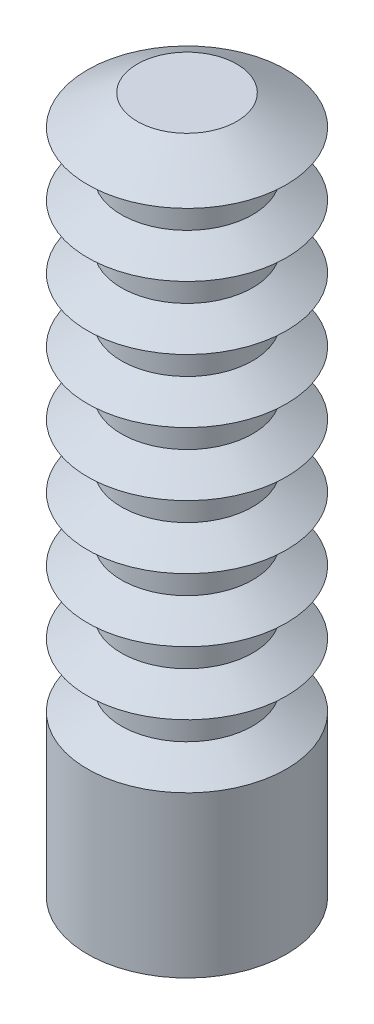
ISO-10303-21;
HEADER;
FILE_DESCRIPTION(('STEP AP214'),'2;1');
FILE_NAME('part.step','',(''),(''),'','','');
FILE_SCHEMA(('AUTOMOTIVE_DESIGN { 1 0 10303 214 1 1 1 1 }'));
ENDSEC;
DATA;
#1=APPLICATION_CONTEXT('core data for automotive mechanical design processes');
#2=APPLICATION_PROTOCOL_DEFINITION('international standard','automotive_design',2000,#1);
#3=PRODUCT_CONTEXT('',#1,'mechanical');
#4=PRODUCT('Part','Part','',(#3));
#5=PRODUCT_RELATED_PRODUCT_CATEGORY('part','',(#4));
#6=PRODUCT_DEFINITION_FORMATION('','',#4);
#7=PRODUCT_DEFINITION_CONTEXT('part definition',#1,'design');
#8=PRODUCT_DEFINITION('design','',#6,#7);
#9=PRODUCT_DEFINITION_SHAPE('','',#8);
#10=(LENGTH_UNIT() NAMED_UNIT(*) SI_UNIT(.MILLI.,.METRE.));
#11=(NAMED_UNIT(*) PLANE_ANGLE_UNIT() SI_UNIT($,.RADIAN.));
#12=(NAMED_UNIT(*) SI_UNIT($,.STERADIAN.) SOLID_ANGLE_UNIT());
#13=UNCERTAINTY_MEASURE_WITH_UNIT(LENGTH_MEASURE(1.E-05),#10,'distance_accuracy_value','');
#14=(GEOMETRIC_REPRESENTATION_CONTEXT(3) GLOBAL_UNCERTAINTY_ASSIGNED_CONTEXT((#13)) GLOBAL_UNIT_ASSIGNED_CONTEXT((#10,
#11,#12)) REPRESENTATION_CONTEXT('',''));
#15=CARTESIAN_POINT('',(0.,0.,0.));
#16=DIRECTION('',(0.,0.,1.));
#17=DIRECTION('',(1.,0.,0.));
#18=AXIS2_PLACEMENT_3D('',#15,#16,#17);
#19=CARTESIAN_POINT('',(0.,-0.800000000000002,0.));
#20=DIRECTION('',(0.,-1.,0.));
#21=DIRECTION('',(1.,0.,0.));
#22=AXIS2_PLACEMENT_3D('',#19,#20,#21);
#23=PLANE('',#22);
#24=CARTESIAN_POINT('',(-5.43163068128454,-0.800000000000002,0.));
#25=DIRECTION('',(0.,1.,0.));
#26=DIRECTION('',(-1.,0.,0.));
#27=AXIS2_PLACEMENT_3D('',#24,#25,#26);
#28=CIRCLE('',#27,5.);
#29=CARTESIAN_POINT('',(-10.4316306812845,-0.800000000000003,0.));
#30=VERTEX_POINT('',#29);
#31=EDGE_CURVE('E48',#30,#30,#28,.T.);
#32=ORIENTED_EDGE('',*,*,#31,.F.);
#33=EDGE_LOOP('',(#32));
#34=FACE_BOUND('',#33,.T.);
#35=ADVANCED_FACE('F32',(#34),#23,.T.);
#36=CARTESIAN_POINT('',(-5.43163068128454,34.1999999999994,0.));
#37=DIRECTION('',(0.,1.,0.));
#38=DIRECTION('',(-1.,0.,0.));
#39=AXIS2_PLACEMENT_3D('',#36,#37,#38);
#40=CYLINDRICAL_SURFACE('',#39,5.00000000000013);
#41=ORIENTED_EDGE('',*,*,#31,.T.);
#42=EDGE_LOOP('',(#41));
#43=FACE_BOUND('',#42,.T.);
#44=CARTESIAN_POINT('',(-5.43163068128454,7.2600000000012,0.));
#45=DIRECTION('',(0.,1.,0.));
#46=DIRECTION('',(-1.,0.,0.));
#47=AXIS2_PLACEMENT_3D('',#44,#45,#46);
#48=CIRCLE('',#47,5.00000000000026);
#49=CARTESIAN_POINT('',(-10.4316306812848,7.2600000000012,0.));
#50=VERTEX_POINT('',#49);
#51=EDGE_CURVE('E53',#50,#50,#48,.T.);
#52=ORIENTED_EDGE('',*,*,#51,.F.);
#53=EDGE_LOOP('',(#52));
#54=FACE_BOUND('',#53,.T.);
#55=ADVANCED_FACE('F241',(#43,#54),#40,.T.);
#56=CARTESIAN_POINT('',(-5.43163068128454,8.28000000000157,0.));
#57=DIRECTION('',(0.,-1.,0.));
#58=DIRECTION('',(1.,0.,0.));
#59=AXIS2_PLACEMENT_3D('',#56,#57,#58);
#60=CONICAL_SURFACE('',#59,3.29999999999555,1.03037682652537);
#61=ORIENTED_EDGE('',*,*,#51,.T.);
#62=EDGE_LOOP('',(#61));
#63=FACE_BOUND('',#62,.T.);
#64=CARTESIAN_POINT('',(-5.43163068128454,8.28000000000157,0.));
#65=DIRECTION('',(0.,1.,0.));
#66=DIRECTION('',(-1.,0.,0.));
#67=AXIS2_PLACEMENT_3D('',#64,#65,#66);
#68=CIRCLE('',#67,3.29999999999555);
#69=CARTESIAN_POINT('',(-8.73163068128009,8.28000000000157,0.));
#70=VERTEX_POINT('',#69);
#71=EDGE_CURVE('E56',#70,#70,#68,.T.);
#72=ORIENTED_EDGE('',*,*,#71,.F.);
#73=EDGE_LOOP('',(#72));
#74=FACE_BOUND('',#73,.T.);
#75=ADVANCED_FACE('F245',(#63,#74),#60,.T.);
#76=CARTESIAN_POINT('',(-5.43163068128454,34.1999999999994,0.));
#77=DIRECTION('',(0.,1.,0.));
#78=DIRECTION('',(-1.,0.,0.));
#79=AXIS2_PLACEMENT_3D('',#76,#77,#78);
#80=CYLINDRICAL_SURFACE('',#79,3.29999999999565);
#81=ORIENTED_EDGE('',*,*,#71,.T.);
#82=EDGE_LOOP('',(#81));
#83=FACE_BOUND('',#82,.T.);
#84=CARTESIAN_POINT('',(-5.43163068128454,9.42000000000347,0.));
#85=DIRECTION('',(0.,1.,0.));
#86=DIRECTION('',(-1.,0.,0.));
#87=AXIS2_PLACEMENT_3D('',#84,#85,#86);
#88=CIRCLE('',#87,3.29999999999575);
#89=CARTESIAN_POINT('',(-8.73163068128029,9.42000000000347,0.));
#90=VERTEX_POINT('',#89);
#91=EDGE_CURVE('E59',#90,#90,#88,.T.);
#92=ORIENTED_EDGE('',*,*,#91,.F.);
#93=EDGE_LOOP('',(#92));
#94=FACE_BOUND('',#93,.T.);
#95=ADVANCED_FACE('F249',(#83,#94),#80,.T.);
#96=CARTESIAN_POINT('',(-5.43163068128454,10.440000000001,0.));
#97=DIRECTION('',(0.,1.,0.));
#98=DIRECTION('',(-1.,0.,0.));
#99=AXIS2_PLACEMENT_3D('',#96,#97,#98);
#100=CONICAL_SURFACE('',#99,5.00000000000023,1.03037682652655);
#101=ORIENTED_EDGE('',*,*,#91,.T.);
#102=EDGE_LOOP('',(#101));
#103=FACE_BOUND('',#102,.T.);
#104=CARTESIAN_POINT('',(-5.43163068128454,10.440000000001,0.));
#105=DIRECTION('',(0.,1.,0.));
#106=DIRECTION('',(-1.,0.,0.));
#107=AXIS2_PLACEMENT_3D('',#104,#105,#106);
#108=CIRCLE('',#107,5.00000000000023);
#109=CARTESIAN_POINT('',(-10.4316306812848,10.440000000001,0.));
#110=VERTEX_POINT('',#109);
#111=EDGE_CURVE('E62',#110,#110,#108,.T.);
#112=ORIENTED_EDGE('',*,*,#111,.F.);
#113=EDGE_LOOP('',(#112));
#114=FACE_BOUND('',#113,.T.);
#115=ADVANCED_FACE('F253',(#103,#114),#100,.T.);
#116=CARTESIAN_POINT('',(-5.43163068128454,11.4600000000014,0.));
#117=DIRECTION('',(0.,-1.,0.));
#118=DIRECTION('',(1.,0.,0.));
#119=AXIS2_PLACEMENT_3D('',#116,#117,#118);
#120=CONICAL_SURFACE('',#119,3.29999999999552,1.03037682652538);
#121=ORIENTED_EDGE('',*,*,#111,.T.);
#122=EDGE_LOOP('',(#121));
#123=FACE_BOUND('',#122,.T.);
#124=CARTESIAN_POINT('',(-5.43163068128454,11.4600000000014,0.));
#125=DIRECTION('',(0.,1.,0.));
#126=DIRECTION('',(-1.,0.,0.));
#127=AXIS2_PLACEMENT_3D('',#124,#125,#126);
#128=CIRCLE('',#127,3.29999999999552);
#129=CARTESIAN_POINT('',(-8.73163068128006,11.4600000000014,0.));
#130=VERTEX_POINT('',#129);
#131=EDGE_CURVE('E65',#130,#130,#128,.T.);
#132=ORIENTED_EDGE('',*,*,#131,.F.);
#133=EDGE_LOOP('',(#132));
#134=FACE_BOUND('',#133,.T.);
#135=ADVANCED_FACE('F257',(#123,#134),#120,.T.);
#136=CARTESIAN_POINT('',(-5.43163068128454,34.1999999999994,0.));
#137=DIRECTION('',(0.,1.,0.));
#138=DIRECTION('',(-1.,0.,0.));
#139=AXIS2_PLACEMENT_3D('',#136,#137,#138);
#140=CYLINDRICAL_SURFACE('',#139,3.29999999999562);
#141=ORIENTED_EDGE('',*,*,#131,.T.);
#142=EDGE_LOOP('',(#141));
#143=FACE_BOUND('',#142,.T.);
#144=CARTESIAN_POINT('',(-5.43163068128454,12.6000000000033,0.));
#145=DIRECTION('',(0.,1.,0.));
#146=DIRECTION('',(-1.,0.,0.));
#147=AXIS2_PLACEMENT_3D('',#144,#145,#146);
#148=CIRCLE('',#147,3.29999999999572);
#149=CARTESIAN_POINT('',(-8.73163068128025,12.6000000000033,0.));
#150=VERTEX_POINT('',#149);
#151=EDGE_CURVE('E68',#150,#150,#148,.T.);
#152=ORIENTED_EDGE('',*,*,#151,.F.);
#153=EDGE_LOOP('',(#152));
#154=FACE_BOUND('',#153,.T.);
#155=ADVANCED_FACE('F261',(#143,#154),#140,.T.);
#156=CARTESIAN_POINT('',(-5.43163068128454,13.6200000000008,0.));
#157=DIRECTION('',(0.,1.,0.));
#158=DIRECTION('',(-1.,0.,0.));
#159=AXIS2_PLACEMENT_3D('',#156,#157,#158);
#160=CONICAL_SURFACE('',#159,5.0000000000002,1.03037682652655);
#161=ORIENTED_EDGE('',*,*,#151,.T.);
#162=EDGE_LOOP('',(#161));
#163=FACE_BOUND('',#162,.T.);
#164=CARTESIAN_POINT('',(-5.43163068128454,13.6200000000008,0.));
#165=DIRECTION('',(0.,1.,0.));
#166=DIRECTION('',(-1.,0.,0.));
#167=AXIS2_PLACEMENT_3D('',#164,#165,#166);
#168=CIRCLE('',#167,5.0000000000002);
#169=CARTESIAN_POINT('',(-10.4316306812847,13.6200000000008,0.));
#170=VERTEX_POINT('',#169);
#171=EDGE_CURVE('E71',#170,#170,#168,.T.);
#172=ORIENTED_EDGE('',*,*,#171,.F.);
#173=EDGE_LOOP('',(#172));
#174=FACE_BOUND('',#173,.T.);
#175=ADVANCED_FACE('F265',(#163,#174),#160,.T.);
#176=CARTESIAN_POINT('',(-5.43163068128454,14.6400000000011,0.));
#177=DIRECTION('',(0.,-1.,0.));
#178=DIRECTION('',(1.,0.,0.));
#179=AXIS2_PLACEMENT_3D('',#176,#177,#178);
#180=CONICAL_SURFACE('',#179,3.29999999999549,1.03037682652538);
#181=ORIENTED_EDGE('',*,*,#171,.T.);
#182=EDGE_LOOP('',(#181));
#183=FACE_BOUND('',#182,.T.);
#184=CARTESIAN_POINT('',(-5.43163068128454,14.6400000000011,0.));
#185=DIRECTION('',(0.,1.,0.));
#186=DIRECTION('',(-1.,0.,0.));
#187=AXIS2_PLACEMENT_3D('',#184,#185,#186);
#188=CIRCLE('',#187,3.29999999999549);
#189=CARTESIAN_POINT('',(-8.73163068128002,14.6400000000011,0.));
#190=VERTEX_POINT('',#189);
#191=EDGE_CURVE('E74',#190,#190,#188,.T.);
#192=ORIENTED_EDGE('',*,*,#191,.F.);
#193=EDGE_LOOP('',(#192));
#194=FACE_BOUND('',#193,.T.);
#195=ADVANCED_FACE('F269',(#183,#194),#180,.T.);
#196=CARTESIAN_POINT('',(-5.43163068128454,34.1999999999994,0.));
#197=DIRECTION('',(0.,1.,0.));
#198=DIRECTION('',(-1.,0.,0.));
#199=AXIS2_PLACEMENT_3D('',#196,#197,#198);
#200=CYLINDRICAL_SURFACE('',#199,3.29999999999558);
#201=ORIENTED_EDGE('',*,*,#191,.T.);
#202=EDGE_LOOP('',(#201));
#203=FACE_BOUND('',#202,.T.);
#204=CARTESIAN_POINT('',(-5.43163068128454,15.780000000003,0.));
#205=DIRECTION('',(0.,1.,0.));
#206=DIRECTION('',(-1.,0.,0.));
#207=AXIS2_PLACEMENT_3D('',#204,#205,#206);
#208=CIRCLE('',#207,3.29999999999568);
#209=CARTESIAN_POINT('',(-8.73163068128022,15.780000000003,0.));
#210=VERTEX_POINT('',#209);
#211=EDGE_CURVE('E77',#210,#210,#208,.T.);
#212=ORIENTED_EDGE('',*,*,#211,.F.);
#213=EDGE_LOOP('',(#212));
#214=FACE_BOUND('',#213,.T.);
#215=ADVANCED_FACE('F273',(#203,#214),#200,.T.);
#216=CARTESIAN_POINT('',(-5.43163068128454,16.8000000000005,0.));
#217=DIRECTION('',(0.,1.,0.));
#218=DIRECTION('',(-1.,0.,0.));
#219=AXIS2_PLACEMENT_3D('',#216,#217,#218);
#220=CONICAL_SURFACE('',#219,5.00000000000017,1.03037682652655);
#221=ORIENTED_EDGE('',*,*,#211,.T.);
#222=EDGE_LOOP('',(#221));
#223=FACE_BOUND('',#222,.T.);
#224=CARTESIAN_POINT('',(-5.43163068128454,16.8000000000005,0.));
#225=DIRECTION('',(0.,1.,0.));
#226=DIRECTION('',(-1.,0.,0.));
#227=AXIS2_PLACEMENT_3D('',#224,#225,#226);
#228=CIRCLE('',#227,5.00000000000017);
#229=CARTESIAN_POINT('',(-10.4316306812847,16.8000000000005,0.));
#230=VERTEX_POINT('',#229);
#231=EDGE_CURVE('E80',#230,#230,#228,.T.);
#232=ORIENTED_EDGE('',*,*,#231,.F.);
#233=EDGE_LOOP('',(#232));
#234=FACE_BOUND('',#233,.T.);
#235=ADVANCED_FACE('F277',(#223,#234),#220,.T.);
#236=CARTESIAN_POINT('',(-5.43163068128454,17.8200000000009,0.));
#237=DIRECTION('',(0.,-1.,0.));
#238=DIRECTION('',(1.,0.,0.));
#239=AXIS2_PLACEMENT_3D('',#236,#237,#238);
#240=CONICAL_SURFACE('',#239,3.29999999999545,1.03037682652538);
#241=ORIENTED_EDGE('',*,*,#231,.T.);
#242=EDGE_LOOP('',(#241));
#243=FACE_BOUND('',#242,.T.);
#244=CARTESIAN_POINT('',(-5.43163068128454,17.8200000000009,0.));
#245=DIRECTION('',(0.,1.,0.));
#246=DIRECTION('',(-1.,0.,0.));
#247=AXIS2_PLACEMENT_3D('',#244,#245,#246);
#248=CIRCLE('',#247,3.29999999999545);
#249=CARTESIAN_POINT('',(-8.73163068127999,17.8200000000009,0.));
#250=VERTEX_POINT('',#249);
#251=EDGE_CURVE('E83',#250,#250,#248,.T.);
#252=ORIENTED_EDGE('',*,*,#251,.F.);
#253=EDGE_LOOP('',(#252));
#254=FACE_BOUND('',#253,.T.);
#255=ADVANCED_FACE('F281',(#243,#254),#240,.T.);
#256=CARTESIAN_POINT('',(-5.43163068128454,34.1999999999994,0.));
#257=DIRECTION('',(0.,1.,0.));
#258=DIRECTION('',(-1.,0.,0.));
#259=AXIS2_PLACEMENT_3D('',#256,#257,#258);
#260=CYLINDRICAL_SURFACE('',#259,3.29999999999555);
#261=ORIENTED_EDGE('',*,*,#251,.T.);
#262=EDGE_LOOP('',(#261));
#263=FACE_BOUND('',#262,.T.);
#264=CARTESIAN_POINT('',(-5.43163068128454,18.9600000000028,0.));
#265=DIRECTION('',(0.,1.,0.));
#266=DIRECTION('',(-1.,0.,0.));
#267=AXIS2_PLACEMENT_3D('',#264,#265,#266);
#268=CIRCLE('',#267,3.29999999999565);
#269=CARTESIAN_POINT('',(-8.73163068128019,18.9600000000028,0.));
#270=VERTEX_POINT('',#269);
#271=EDGE_CURVE('E86',#270,#270,#268,.T.);
#272=ORIENTED_EDGE('',*,*,#271,.F.);
#273=EDGE_LOOP('',(#272));
#274=FACE_BOUND('',#273,.T.);
#275=ADVANCED_FACE('F285',(#263,#274),#260,.T.);
#276=CARTESIAN_POINT('',(-5.43163068128454,19.9800000000003,0.));
#277=DIRECTION('',(0.,1.,0.));
#278=DIRECTION('',(-1.,0.,0.));
#279=AXIS2_PLACEMENT_3D('',#276,#277,#278);
#280=CONICAL_SURFACE('',#279,5.00000000000013,1.03037682652656);
#281=ORIENTED_EDGE('',*,*,#271,.T.);
#282=EDGE_LOOP('',(#281));
#283=FACE_BOUND('',#282,.T.);
#284=CARTESIAN_POINT('',(-5.43163068128454,19.9800000000003,0.));
#285=DIRECTION('',(0.,1.,0.));
#286=DIRECTION('',(-1.,0.,0.));
#287=AXIS2_PLACEMENT_3D('',#284,#285,#286);
#288=CIRCLE('',#287,5.00000000000013);
#289=CARTESIAN_POINT('',(-10.4316306812847,19.9800000000003,0.));
#290=VERTEX_POINT('',#289);
#291=EDGE_CURVE('E89',#290,#290,#288,.T.);
#292=ORIENTED_EDGE('',*,*,#291,.F.);
#293=EDGE_LOOP('',(#292));
#294=FACE_BOUND('',#293,.T.);
#295=ADVANCED_FACE('F289',(#283,#294),#280,.T.);
#296=CARTESIAN_POINT('',(-5.43163068128454,21.0000000000007,0.));
#297=DIRECTION('',(0.,-1.,0.));
#298=DIRECTION('',(1.,0.,0.));
#299=AXIS2_PLACEMENT_3D('',#296,#297,#298);
#300=CONICAL_SURFACE('',#299,3.29999999999542,1.03037682652538);
#301=ORIENTED_EDGE('',*,*,#291,.T.);
#302=EDGE_LOOP('',(#301));
#303=FACE_BOUND('',#302,.T.);
#304=CARTESIAN_POINT('',(-5.43163068128454,21.0000000000007,0.));
#305=DIRECTION('',(0.,1.,0.));
#306=DIRECTION('',(-1.,0.,0.));
#307=AXIS2_PLACEMENT_3D('',#304,#305,#306);
#308=CIRCLE('',#307,3.29999999999542);
#309=CARTESIAN_POINT('',(-8.73163068127996,21.0000000000007,0.));
#310=VERTEX_POINT('',#309);
#311=EDGE_CURVE('E92',#310,#310,#308,.T.);
#312=ORIENTED_EDGE('',*,*,#311,.F.);
#313=EDGE_LOOP('',(#312));
#314=FACE_BOUND('',#313,.T.);
#315=ADVANCED_FACE('F293',(#303,#314),#300,.T.);
#316=CARTESIAN_POINT('',(-5.43163068128454,34.1999999999994,0.));
#317=DIRECTION('',(0.,1.,0.));
#318=DIRECTION('',(-1.,0.,0.));
#319=AXIS2_PLACEMENT_3D('',#316,#317,#318);
#320=CYLINDRICAL_SURFACE('',#319,3.29999999999552);
#321=ORIENTED_EDGE('',*,*,#311,.T.);
#322=EDGE_LOOP('',(#321));
#323=FACE_BOUND('',#322,.T.);
#324=CARTESIAN_POINT('',(-5.43163068128454,22.1400000000026,0.));
#325=DIRECTION('',(0.,1.,0.));
#326=DIRECTION('',(-1.,0.,0.));
#327=AXIS2_PLACEMENT_3D('',#324,#325,#326);
#328=CIRCLE('',#327,3.29999999999562);
#329=CARTESIAN_POINT('',(-8.73163068128015,22.1400000000026,0.));
#330=VERTEX_POINT('',#329);
#331=EDGE_CURVE('E95',#330,#330,#328,.T.);
#332=ORIENTED_EDGE('',*,*,#331,.F.);
#333=EDGE_LOOP('',(#332));
#334=FACE_BOUND('',#333,.T.);
#335=ADVANCED_FACE('F297',(#323,#334),#320,.T.);
#336=CARTESIAN_POINT('',(-5.43163068128454,23.1600000000001,0.));
#337=DIRECTION('',(0.,1.,0.));
#338=DIRECTION('',(-1.,0.,0.));
#339=AXIS2_PLACEMENT_3D('',#336,#337,#338);
#340=CONICAL_SURFACE('',#339,5.0000000000001,1.03037682652655);
#341=ORIENTED_EDGE('',*,*,#331,.T.);
#342=EDGE_LOOP('',(#341));
#343=FACE_BOUND('',#342,.T.);
#344=CARTESIAN_POINT('',(-5.43163068128454,23.1600000000001,0.));
#345=DIRECTION('',(0.,1.,0.));
#346=DIRECTION('',(-1.,0.,0.));
#347=AXIS2_PLACEMENT_3D('',#344,#345,#346);
#348=CIRCLE('',#347,5.0000000000001);
#349=CARTESIAN_POINT('',(-10.4316306812846,23.1600000000001,0.));
#350=VERTEX_POINT('',#349);
#351=EDGE_CURVE('E98',#350,#350,#348,.T.);
#352=ORIENTED_EDGE('',*,*,#351,.F.);
#353=EDGE_LOOP('',(#352));
#354=FACE_BOUND('',#353,.T.);
#355=ADVANCED_FACE('F301',(#343,#354),#340,.T.);
#356=CARTESIAN_POINT('',(-5.43163068128454,24.1800000000005,0.));
#357=DIRECTION('',(0.,-1.,0.));
#358=DIRECTION('',(1.,0.,0.));
#359=AXIS2_PLACEMENT_3D('',#356,#357,#358);
#360=CONICAL_SURFACE('',#359,3.29999999999539,1.03037682652538);
#361=ORIENTED_EDGE('',*,*,#351,.T.);
#362=EDGE_LOOP('',(#361));
#363=FACE_BOUND('',#362,.T.);
#364=CARTESIAN_POINT('',(-5.43163068128454,24.1800000000005,0.));
#365=DIRECTION('',(0.,1.,0.));
#366=DIRECTION('',(-1.,0.,0.));
#367=AXIS2_PLACEMENT_3D('',#364,#365,#366);
#368=CIRCLE('',#367,3.29999999999539);
#369=CARTESIAN_POINT('',(-8.73163068127993,24.1800000000005,0.));
#370=VERTEX_POINT('',#369);
#371=EDGE_CURVE('E101',#370,#370,#368,.T.);
#372=ORIENTED_EDGE('',*,*,#371,.F.);
#373=EDGE_LOOP('',(#372));
#374=FACE_BOUND('',#373,.T.);
#375=ADVANCED_FACE('F305',(#363,#374),#360,.T.);
#376=CARTESIAN_POINT('',(-5.43163068128454,34.1999999999994,0.));
#377=DIRECTION('',(0.,1.,0.));
#378=DIRECTION('',(-1.,0.,0.));
#379=AXIS2_PLACEMENT_3D('',#376,#377,#378);
#380=CYLINDRICAL_SURFACE('',#379,3.29999999999549);
#381=ORIENTED_EDGE('',*,*,#371,.T.);
#382=EDGE_LOOP('',(#381));
#383=FACE_BOUND('',#382,.T.);
#384=CARTESIAN_POINT('',(-5.43163068128454,25.3200000000024,0.));
#385=DIRECTION('',(0.,1.,0.));
#386=DIRECTION('',(-1.,0.,0.));
#387=AXIS2_PLACEMENT_3D('',#384,#385,#386);
#388=CIRCLE('',#387,3.29999999999558);
#389=CARTESIAN_POINT('',(-8.73163068128012,25.3200000000024,0.));
#390=VERTEX_POINT('',#389);
#391=EDGE_CURVE('E104',#390,#390,#388,.T.);
#392=ORIENTED_EDGE('',*,*,#391,.F.);
#393=EDGE_LOOP('',(#392));
#394=FACE_BOUND('',#393,.T.);
#395=ADVANCED_FACE('F309',(#383,#394),#380,.T.);
#396=CARTESIAN_POINT('',(-5.43163068128454,26.3399999999999,0.));
#397=DIRECTION('',(0.,1.,0.));
#398=DIRECTION('',(-1.,0.,0.));
#399=AXIS2_PLACEMENT_3D('',#396,#397,#398);
#400=CONICAL_SURFACE('',#399,5.00000000000007,1.03037682652655);
#401=ORIENTED_EDGE('',*,*,#391,.T.);
#402=EDGE_LOOP('',(#401));
#403=FACE_BOUND('',#402,.T.);
#404=CARTESIAN_POINT('',(-5.43163068128454,26.3399999999999,0.));
#405=DIRECTION('',(0.,1.,0.));
#406=DIRECTION('',(-1.,0.,0.));
#407=AXIS2_PLACEMENT_3D('',#404,#405,#406);
#408=CIRCLE('',#407,5.00000000000007);
#409=CARTESIAN_POINT('',(-10.4316306812846,26.3399999999999,0.));
#410=VERTEX_POINT('',#409);
#411=EDGE_CURVE('E107',#410,#410,#408,.T.);
#412=ORIENTED_EDGE('',*,*,#411,.F.);
#413=EDGE_LOOP('',(#412));
#414=FACE_BOUND('',#413,.T.);
#415=ADVANCED_FACE('F313',(#403,#414),#400,.T.);
#416=CARTESIAN_POINT('',(-5.43163068128454,27.3600000000005,0.));
#417=DIRECTION('',(0.,-1.,0.));
#418=DIRECTION('',(1.,0.,0.));
#419=AXIS2_PLACEMENT_3D('',#416,#417,#418);
#420=CONICAL_SURFACE('',#419,3.29999999999549,1.03037682652524);
#421=ORIENTED_EDGE('',*,*,#411,.T.);
#422=EDGE_LOOP('',(#421));
#423=FACE_BOUND('',#422,.T.);
#424=CARTESIAN_POINT('',(-5.43163068128454,27.3600000000005,0.));
#425=DIRECTION('',(0.,1.,0.));
#426=DIRECTION('',(-1.,0.,0.));
#427=AXIS2_PLACEMENT_3D('',#424,#425,#426);
#428=CIRCLE('',#427,3.29999999999549);
#429=CARTESIAN_POINT('',(-8.73163068128003,27.3600000000005,0.));
#430=VERTEX_POINT('',#429);
#431=EDGE_CURVE('E110',#430,#430,#428,.T.);
#432=ORIENTED_EDGE('',*,*,#431,.F.);
#433=EDGE_LOOP('',(#432));
#434=FACE_BOUND('',#433,.T.);
#435=ADVANCED_FACE('F317',(#423,#434),#420,.T.);
#436=CARTESIAN_POINT('',(-5.43163068128454,34.1999999999994,0.));
#437=DIRECTION('',(0.,1.,0.));
#438=DIRECTION('',(-1.,0.,0.));
#439=AXIS2_PLACEMENT_3D('',#436,#437,#438);
#440=CYLINDRICAL_SURFACE('',#439,3.29999999999552);
#441=ORIENTED_EDGE('',*,*,#431,.T.);
#442=EDGE_LOOP('',(#441));
#443=FACE_BOUND('',#442,.T.);
#444=CARTESIAN_POINT('',(-5.43163068128454,28.5000000000021,0.));
#445=DIRECTION('',(0.,1.,0.));
#446=DIRECTION('',(-1.,0.,0.));
#447=AXIS2_PLACEMENT_3D('',#444,#445,#446);
#448=CIRCLE('',#447,3.29999999999555);
#449=CARTESIAN_POINT('',(-8.73163068128009,28.5000000000021,0.));
#450=VERTEX_POINT('',#449);
#451=EDGE_CURVE('E113',#450,#450,#448,.T.);
#452=ORIENTED_EDGE('',*,*,#451,.F.);
#453=EDGE_LOOP('',(#452));
#454=FACE_BOUND('',#453,.T.);
#455=ADVANCED_FACE('F321',(#443,#454),#440,.T.);
#456=CARTESIAN_POINT('',(-5.43163068128454,29.5199999999997,0.));
#457=DIRECTION('',(0.,1.,0.));
#458=DIRECTION('',(-1.,0.,0.));
#459=AXIS2_PLACEMENT_3D('',#456,#457,#458);
#460=CONICAL_SURFACE('',#459,5.00000000000004,1.03037682652655);
#461=ORIENTED_EDGE('',*,*,#451,.T.);
#462=EDGE_LOOP('',(#461));
#463=FACE_BOUND('',#462,.T.);
#464=CARTESIAN_POINT('',(-5.43163068128454,29.5199999999997,0.));
#465=DIRECTION('',(0.,1.,0.));
#466=DIRECTION('',(-1.,0.,0.));
#467=AXIS2_PLACEMENT_3D('',#464,#465,#466);
#468=CIRCLE('',#467,5.00000000000004);
#469=CARTESIAN_POINT('',(-10.4316306812846,29.5199999999997,0.));
#470=VERTEX_POINT('',#469);
#471=EDGE_CURVE('E116',#470,#470,#468,.T.);
#472=ORIENTED_EDGE('',*,*,#471,.F.);
#473=EDGE_LOOP('',(#472));
#474=FACE_BOUND('',#473,.T.);
#475=ADVANCED_FACE('F325',(#463,#474),#460,.T.);
#476=CARTESIAN_POINT('',(-5.43163068128454,30.54,0.));
#477=DIRECTION('',(0.,-1.,0.));
#478=DIRECTION('',(1.,0.,0.));
#479=AXIS2_PLACEMENT_3D('',#476,#477,#478);
#480=CONICAL_SURFACE('',#479,3.29999999999532,1.03037682652538);
#481=ORIENTED_EDGE('',*,*,#471,.T.);
#482=EDGE_LOOP('',(#481));
#483=FACE_BOUND('',#482,.T.);
#484=CARTESIAN_POINT('',(-5.43163068128454,30.54,0.));
#485=DIRECTION('',(0.,1.,0.));
#486=DIRECTION('',(-1.,0.,0.));
#487=AXIS2_PLACEMENT_3D('',#484,#485,#486);
#488=CIRCLE('',#487,3.29999999999532);
#489=CARTESIAN_POINT('',(-8.73163068127986,30.54,0.));
#490=VERTEX_POINT('',#489);
#491=EDGE_CURVE('E119',#490,#490,#488,.T.);
#492=ORIENTED_EDGE('',*,*,#491,.F.);
#493=EDGE_LOOP('',(#492));
#494=FACE_BOUND('',#493,.T.);
#495=ADVANCED_FACE('F329',(#483,#494),#480,.T.);
#496=CARTESIAN_POINT('',(-5.43163068128454,34.1999999999994,0.));
#497=DIRECTION('',(0.,1.,0.));
#498=DIRECTION('',(-1.,0.,0.));
#499=AXIS2_PLACEMENT_3D('',#496,#497,#498);
#500=CYLINDRICAL_SURFACE('',#499,3.29999999999542);
#501=ORIENTED_EDGE('',*,*,#491,.T.);
#502=EDGE_LOOP('',(#501));
#503=FACE_BOUND('',#502,.T.);
#504=CARTESIAN_POINT('',(-5.43163068128454,31.6800000000019,0.));
#505=DIRECTION('',(0.,1.,0.));
#506=DIRECTION('',(-1.,0.,0.));
#507=AXIS2_PLACEMENT_3D('',#504,#505,#506);
#508=CIRCLE('',#507,3.29999999999552);
#509=CARTESIAN_POINT('',(-8.73163068128006,31.6800000000019,0.));
#510=VERTEX_POINT('',#509);
#511=EDGE_CURVE('E122',#510,#510,#508,.T.);
#512=ORIENTED_EDGE('',*,*,#511,.F.);
#513=EDGE_LOOP('',(#512));
#514=FACE_BOUND('',#513,.T.);
#515=ADVANCED_FACE('F333',(#503,#514),#500,.T.);
#516=CARTESIAN_POINT('',(-5.43163068128454,32.6999999999994,0.));
#517=DIRECTION('',(0.,1.,0.));
#518=DIRECTION('',(-1.,0.,0.));
#519=AXIS2_PLACEMENT_3D('',#516,#517,#518);
#520=CONICAL_SURFACE('',#519,5.,1.03037682652655);
#521=ORIENTED_EDGE('',*,*,#511,.T.);
#522=EDGE_LOOP('',(#521));
#523=FACE_BOUND('',#522,.T.);
#524=CARTESIAN_POINT('',(-5.43163068128454,32.6999999999994,0.));
#525=DIRECTION('',(0.,1.,0.));
#526=DIRECTION('',(-1.,0.,0.));
#527=AXIS2_PLACEMENT_3D('',#524,#525,#526);
#528=CIRCLE('',#527,5.);
#529=CARTESIAN_POINT('',(-10.4316306812845,32.6999999999994,0.));
#530=VERTEX_POINT('',#529);
#531=EDGE_CURVE('E125',#530,#530,#528,.T.);
#532=ORIENTED_EDGE('',*,*,#531,.F.);
#533=EDGE_LOOP('',(#532));
#534=FACE_BOUND('',#533,.T.);
#535=ADVANCED_FACE('F337',(#523,#534),#520,.T.);
#536=CARTESIAN_POINT('',(-5.43163068128454,34.1999999999994,0.));
#537=DIRECTION('',(0.,-1.,0.));
#538=DIRECTION('',(1.,0.,0.));
#539=AXIS2_PLACEMENT_3D('',#536,#537,#538);
#540=CONICAL_SURFACE('',#539,2.5,1.03037682652431);
#541=ORIENTED_EDGE('',*,*,#531,.T.);
#542=EDGE_LOOP('',(#541));
#543=FACE_BOUND('',#542,.T.);
#544=CARTESIAN_POINT('',(-5.43163068128454,34.1999999999994,0.));
#545=DIRECTION('',(0.,1.,0.));
#546=DIRECTION('',(-1.,0.,0.));
#547=AXIS2_PLACEMENT_3D('',#544,#545,#546);
#548=CIRCLE('',#547,2.5);
#549=CARTESIAN_POINT('',(-7.93163068128454,34.1999999999994,0.));
#550=VERTEX_POINT('',#549);
#551=EDGE_CURVE('E128',#550,#550,#548,.T.);
#552=ORIENTED_EDGE('',*,*,#551,.F.);
#553=EDGE_LOOP('',(#552));
#554=FACE_BOUND('',#553,.T.);
#555=ADVANCED_FACE('F341',(#543,#554),#540,.T.);
#556=CARTESIAN_POINT('',(0.,34.1999999999994,0.));
#557=DIRECTION('',(0.,-1.,0.));
#558=DIRECTION('',(1.,0.,0.));
#559=AXIS2_PLACEMENT_3D('',#556,#557,#558);
#560=PLANE('',#559);
#561=ORIENTED_EDGE('',*,*,#551,.T.);
#562=EDGE_LOOP('',(#561));
#563=FACE_BOUND('',#562,.T.);
#564=ADVANCED_FACE('F345',(#563),#560,.F.);
#565=CLOSED_SHELL('',(#35,#55,#75,#95,#115,#135,#155,#175,#195,#215,#235,#255,#275,#295,#315,
#335,#355,#375,#395,#415,#435,#455,#475,#495,#515,#535,#555,#564));
#566=CARTESIAN_POINT('',(-5.43163068128454,7.9600000000012,0.));
#567=DIRECTION('',(0.,-1.,0.));
#568=DIRECTION('',(1.,0.,0.));
#569=AXIS2_PLACEMENT_3D('',#566,#567,#568);
#570=CONICAL_SURFACE('',#569,2.29276466619247,1.02132101334301);
#571=CARTESIAN_POINT('',(-5.43163068128454,7.25999999999998,0.));
#572=DIRECTION('',(0.,1.,0.));
#573=DIRECTION('',(-1.,0.,0.));
#574=AXIS2_PLACEMENT_3D('',#571,#572,#573);
#575=CIRCLE('',#574,3.43583917011756);
#576=CARTESIAN_POINT('',(-8.8674698514021,7.25999999999998,0.));
#577=VERTEX_POINT('',#576);
#578=EDGE_CURVE('E10',#577,#577,#575,.T.);
#579=ORIENTED_EDGE('',*,*,#578,.F.);
#580=EDGE_LOOP('',(#579));
#581=FACE_BOUND('',#580,.T.);
#582=CARTESIAN_POINT('',(-5.43163068128454,7.9600000000012,0.));
#583=DIRECTION('',(0.,1.,0.));
#584=DIRECTION('',(-1.,0.,0.));
#585=AXIS2_PLACEMENT_3D('',#582,#583,#584);
#586=CIRCLE('',#585,2.29276466619247);
#587=CARTESIAN_POINT('',(-7.72439534747701,7.9600000000012,0.));
#588=VERTEX_POINT('',#587);
#589=EDGE_CURVE('E203',#588,#588,#586,.T.);
#590=ORIENTED_EDGE('',*,*,#589,.T.);
#591=EDGE_LOOP('',(#590));
#592=FACE_BOUND('',#591,.T.);
#593=ADVANCED_FACE('F34',(#581,#592),#570,.F.);
#594=CARTESIAN_POINT('',(-5.43163068128454,7.25999999999998,0.));
#595=DIRECTION('',(0.,-1.,0.));
#596=DIRECTION('',(1.,0.,0.));
#597=AXIS2_PLACEMENT_3D('',#594,#595,#596);
#598=CONICAL_SURFACE('',#597,3.43583917011756,1.02509404757199);
#599=CARTESIAN_POINT('',(-5.43163068128454,6.79599581917429,0.));
#600=DIRECTION('',(0.,1.,0.));
#601=DIRECTION('',(-1.,0.,0.));
#602=AXIS2_PLACEMENT_3D('',#599,#600,#601);
#603=CIRCLE('',#602,4.2);
#604=CARTESIAN_POINT('',(-9.63163068128454,6.79599581917429,0.));
#605=VERTEX_POINT('',#604);
#606=EDGE_CURVE('E40',#605,#605,#603,.T.);
#607=ORIENTED_EDGE('',*,*,#606,.F.);
#608=EDGE_LOOP('',(#607));
#609=FACE_BOUND('',#608,.T.);
#610=ORIENTED_EDGE('',*,*,#578,.T.);
#611=EDGE_LOOP('',(#610));
#612=FACE_BOUND('',#611,.T.);
#613=ADVANCED_FACE('F221',(#609,#612),#598,.F.);
#614=CARTESIAN_POINT('',(-5.43163068128454,34.1999999999994,0.));
#615=DIRECTION('',(0.,1.,0.));
#616=DIRECTION('',(-1.,0.,0.));
#617=AXIS2_PLACEMENT_3D('',#614,#615,#616);
#618=CYLINDRICAL_SURFACE('',#617,4.2);
#619=ORIENTED_EDGE('',*,*,#606,.T.);
#620=EDGE_LOOP('',(#619));
#621=FACE_BOUND('',#620,.T.);
#622=CARTESIAN_POINT('',(-5.43163068128454,0.,0.));
#623=DIRECTION('',(0.,1.,0.));
#624=DIRECTION('',(-1.,0.,0.));
#625=AXIS2_PLACEMENT_3D('',#622,#623,#624);
#626=CIRCLE('',#625,4.2);
#627=CARTESIAN_POINT('',(-9.63163068128454,0.,0.));
#628=VERTEX_POINT('',#627);
#629=EDGE_CURVE('E44',#628,#628,#626,.T.);
#630=ORIENTED_EDGE('',*,*,#629,.F.);
#631=EDGE_LOOP('',(#630));
#632=FACE_BOUND('',#631,.T.);
#633=ADVANCED_FACE('F227',(#621,#632),#618,.F.);
#634=CARTESIAN_POINT('',(0.,0.,0.));
#635=DIRECTION('',(0.,1.,0.));
#636=DIRECTION('',(-1.,0.,0.));
#637=AXIS2_PLACEMENT_3D('',#634,#635,#636);
#638=PLANE('',#637);
#639=ORIENTED_EDGE('',*,*,#629,.T.);
#640=EDGE_LOOP('',(#639));
#641=FACE_BOUND('',#640,.T.);
#642=ADVANCED_FACE('F232',(#641),#638,.T.);
#643=CARTESIAN_POINT('',(0.,33.3999999999994,0.));
#644=DIRECTION('',(0.,1.,0.));
#645=DIRECTION('',(-1.,0.,0.));
#646=AXIS2_PLACEMENT_3D('',#643,#644,#645);
#647=PLANE('',#646);
#648=CARTESIAN_POINT('',(-5.43163068128454,33.3999999999994,0.));
#649=DIRECTION('',(0.,1.,0.));
#650=DIRECTION('',(-1.,0.,0.));
#651=AXIS2_PLACEMENT_3D('',#648,#649,#650);
#652=CIRCLE('',#651,2.29276466619221);
#653=CARTESIAN_POINT('',(-7.72439534747675,33.3999999999994,0.));
#654=VERTEX_POINT('',#653);
#655=EDGE_CURVE('E131',#654,#654,#652,.T.);
#656=ORIENTED_EDGE('',*,*,#655,.F.);
#657=EDGE_LOOP('',(#656));
#658=FACE_BOUND('',#657,.T.);
#659=ADVANCED_FACE('F237',(#658),#647,.F.);
#660=CARTESIAN_POINT('',(-5.43163068128454,32.6999999999982,0.));
#661=DIRECTION('',(0.,-1.,0.));
#662=DIRECTION('',(1.,0.,0.));
#663=AXIS2_PLACEMENT_3D('',#660,#661,#662);
#664=CONICAL_SURFACE('',#663,3.4358391701173,1.02132101334301);
#665=ORIENTED_EDGE('',*,*,#655,.T.);
#666=EDGE_LOOP('',(#665));
#667=FACE_BOUND('',#666,.T.);
#668=CARTESIAN_POINT('',(-5.43163068128454,32.6999999999982,0.));
#669=DIRECTION('',(0.,1.,0.));
#670=DIRECTION('',(-1.,0.,0.));
#671=AXIS2_PLACEMENT_3D('',#668,#669,#670);
#672=CIRCLE('',#671,3.4358391701173);
#673=CARTESIAN_POINT('',(-8.86746985140184,32.6999999999982,0.));
#674=VERTEX_POINT('',#673);
#675=EDGE_CURVE('E134',#674,#674,#672,.T.);
#676=ORIENTED_EDGE('',*,*,#675,.F.);
#677=EDGE_LOOP('',(#676));
#678=FACE_BOUND('',#677,.T.);
#679=ADVANCED_FACE('F351',(#667,#678),#664,.F.);
#680=CARTESIAN_POINT('',(-5.43163068128454,32.014155297645,0.));
#681=DIRECTION('',(0.,1.,0.));
#682=DIRECTION('',(-1.,0.,0.));
#683=AXIS2_PLACEMENT_3D('',#680,#681,#682);
#684=CONICAL_SURFACE('',#683,2.29276466619226,1.03037682652546);
#685=ORIENTED_EDGE('',*,*,#675,.T.);
#686=EDGE_LOOP('',(#685));
#687=FACE_BOUND('',#686,.T.);
#688=CARTESIAN_POINT('',(-5.43163068128454,32.014155297645,0.));
#689=DIRECTION('',(0.,1.,0.));
#690=DIRECTION('',(-1.,0.,0.));
#691=AXIS2_PLACEMENT_3D('',#688,#689,#690);
#692=CIRCLE('',#691,2.29276466619226);
#693=CARTESIAN_POINT('',(-7.7243953474768,32.014155297645,0.));
#694=VERTEX_POINT('',#693);
#695=EDGE_CURVE('E137',#694,#694,#692,.T.);
#696=ORIENTED_EDGE('',*,*,#695,.F.);
#697=EDGE_LOOP('',(#696));
#698=FACE_BOUND('',#697,.T.);
#699=ADVANCED_FACE('F355',(#687,#698),#684,.F.);
#700=CARTESIAN_POINT('',(-5.43163068128454,34.1999999999994,0.));
#701=DIRECTION('',(0.,1.,0.));
#702=DIRECTION('',(-1.,0.,0.));
#703=AXIS2_PLACEMENT_3D('',#700,#701,#702);
#704=CYLINDRICAL_SURFACE('',#703,2.29276466619225);
#705=ORIENTED_EDGE('',*,*,#695,.T.);
#706=EDGE_LOOP('',(#705));
#707=FACE_BOUND('',#706,.T.);
#708=CARTESIAN_POINT('',(-5.43163068128454,30.2199999999997,0.));
#709=DIRECTION('',(0.,1.,0.));
#710=DIRECTION('',(-1.,0.,0.));
#711=AXIS2_PLACEMENT_3D('',#708,#709,#710);
#712=CIRCLE('',#711,2.29276466619224);
#713=CARTESIAN_POINT('',(-7.72439534747678,30.2199999999997,0.));
#714=VERTEX_POINT('',#713);
#715=EDGE_CURVE('E140',#714,#714,#712,.T.);
#716=ORIENTED_EDGE('',*,*,#715,.F.);
#717=EDGE_LOOP('',(#716));
#718=FACE_BOUND('',#717,.T.);
#719=ADVANCED_FACE('F359',(#707,#718),#704,.F.);
#720=CARTESIAN_POINT('',(-5.43163068128454,30.2199999999997,0.));
#721=DIRECTION('',(0.,-1.,0.));
#722=DIRECTION('',(1.,0.,0.));
#723=AXIS2_PLACEMENT_3D('',#720,#721,#722);
#724=CONICAL_SURFACE('',#723,2.29276466619224,1.02132101334301);
#725=CARTESIAN_POINT('',(-5.43163068128454,29.5199999999984,0.));
#726=DIRECTION('',(0.,1.,0.));
#727=DIRECTION('',(-1.,0.,0.));
#728=AXIS2_PLACEMENT_3D('',#725,#726,#727);
#729=CIRCLE('',#728,3.43583917011733);
#730=CARTESIAN_POINT('',(-8.86746985140187,29.5199999999984,0.));
#731=VERTEX_POINT('',#730);
#732=EDGE_CURVE('E143',#731,#731,#729,.T.);
#733=ORIENTED_EDGE('',*,*,#732,.F.);
#734=EDGE_LOOP('',(#733));
#735=FACE_BOUND('',#734,.T.);
#736=ORIENTED_EDGE('',*,*,#715,.T.);
#737=EDGE_LOOP('',(#736));
#738=FACE_BOUND('',#737,.T.);
#739=ADVANCED_FACE('F363',(#735,#738),#724,.F.);
#740=CARTESIAN_POINT('',(-5.43163068128454,28.8341552976452,0.));
#741=DIRECTION('',(0.,1.,0.));
#742=DIRECTION('',(-1.,0.,0.));
#743=AXIS2_PLACEMENT_3D('',#740,#741,#742);
#744=CONICAL_SURFACE('',#743,2.2927646661923,1.03037682652546);
#745=ORIENTED_EDGE('',*,*,#732,.T.);
#746=EDGE_LOOP('',(#745));
#747=FACE_BOUND('',#746,.T.);
#748=CARTESIAN_POINT('',(-5.43163068128454,28.8341552976452,0.));
#749=DIRECTION('',(0.,1.,0.));
#750=DIRECTION('',(-1.,0.,0.));
#751=AXIS2_PLACEMENT_3D('',#748,#749,#750);
#752=CIRCLE('',#751,2.2927646661923);
#753=CARTESIAN_POINT('',(-7.72439534747684,28.8341552976452,0.));
#754=VERTEX_POINT('',#753);
#755=EDGE_CURVE('E146',#754,#754,#752,.T.);
#756=ORIENTED_EDGE('',*,*,#755,.F.);
#757=EDGE_LOOP('',(#756));
#758=FACE_BOUND('',#757,.T.);
#759=ADVANCED_FACE('F367',(#747,#758),#744,.F.);
#760=CARTESIAN_POINT('',(-5.43163068128454,34.1999999999994,0.));
#761=DIRECTION('',(0.,1.,0.));
#762=DIRECTION('',(-1.,0.,0.));
#763=AXIS2_PLACEMENT_3D('',#760,#761,#762);
#764=CYLINDRICAL_SURFACE('',#763,2.29276466619238);
#765=ORIENTED_EDGE('',*,*,#755,.T.);
#766=EDGE_LOOP('',(#765));
#767=FACE_BOUND('',#766,.T.);
#768=CARTESIAN_POINT('',(-5.43163068128454,27.04,0.));
#769=DIRECTION('',(0.,1.,0.));
#770=DIRECTION('',(-1.,0.,0.));
#771=AXIS2_PLACEMENT_3D('',#768,#769,#770);
#772=CIRCLE('',#771,2.29276466619246);
#773=CARTESIAN_POINT('',(-7.724395347477,27.04,0.));
#774=VERTEX_POINT('',#773);
#775=EDGE_CURVE('E149',#774,#774,#772,.T.);
#776=ORIENTED_EDGE('',*,*,#775,.F.);
#777=EDGE_LOOP('',(#776));
#778=FACE_BOUND('',#777,.T.);
#779=ADVANCED_FACE('F371',(#767,#778),#764,.F.);
#780=CARTESIAN_POINT('',(-5.43163068128454,27.04,0.));
#781=DIRECTION('',(0.,-1.,0.));
#782=DIRECTION('',(1.,0.,0.));
#783=AXIS2_PLACEMENT_3D('',#780,#781,#782);
#784=CONICAL_SURFACE('',#783,2.29276466619246,1.02132101334285);
#785=CARTESIAN_POINT('',(-5.43163068128454,26.3399999999987,0.));
#786=DIRECTION('',(0.,1.,0.));
#787=DIRECTION('',(-1.,0.,0.));
#788=AXIS2_PLACEMENT_3D('',#785,#786,#787);
#789=CIRCLE('',#788,3.43583917011736);
#790=CARTESIAN_POINT('',(-8.8674698514019,26.3399999999987,0.));
#791=VERTEX_POINT('',#790);
#792=EDGE_CURVE('E152',#791,#791,#789,.T.);
#793=ORIENTED_EDGE('',*,*,#792,.F.);
#794=EDGE_LOOP('',(#793));
#795=FACE_BOUND('',#794,.T.);
#796=ORIENTED_EDGE('',*,*,#775,.T.);
#797=EDGE_LOOP('',(#796));
#798=FACE_BOUND('',#797,.T.);
#799=ADVANCED_FACE('F375',(#795,#798),#784,.F.);
#800=CARTESIAN_POINT('',(-5.43163068128454,25.6541552976454,0.));
#801=DIRECTION('',(0.,1.,0.));
#802=DIRECTION('',(-1.,0.,0.));
#803=AXIS2_PLACEMENT_3D('',#800,#801,#802);
#804=CONICAL_SURFACE('',#803,2.29276466619233,1.03037682652546);
#805=ORIENTED_EDGE('',*,*,#792,.T.);
#806=EDGE_LOOP('',(#805));
#807=FACE_BOUND('',#806,.T.);
#808=CARTESIAN_POINT('',(-5.43163068128454,25.6541552976454,0.));
#809=DIRECTION('',(0.,1.,0.));
#810=DIRECTION('',(-1.,0.,0.));
#811=AXIS2_PLACEMENT_3D('',#808,#809,#810);
#812=CIRCLE('',#811,2.29276466619233);
#813=CARTESIAN_POINT('',(-7.72439534747687,25.6541552976454,0.));
#814=VERTEX_POINT('',#813);
#815=EDGE_CURVE('E155',#814,#814,#812,.T.);
#816=ORIENTED_EDGE('',*,*,#815,.F.);
#817=EDGE_LOOP('',(#816));
#818=FACE_BOUND('',#817,.T.);
#819=ADVANCED_FACE('F379',(#807,#818),#804,.F.);
#820=CARTESIAN_POINT('',(-5.43163068128454,34.1999999999994,0.));
#821=DIRECTION('',(0.,1.,0.));
#822=DIRECTION('',(-1.,0.,0.));
#823=AXIS2_PLACEMENT_3D('',#820,#821,#822);
#824=CYLINDRICAL_SURFACE('',#823,2.29276466619241);
#825=ORIENTED_EDGE('',*,*,#815,.T.);
#826=EDGE_LOOP('',(#825));
#827=FACE_BOUND('',#826,.T.);
#828=CARTESIAN_POINT('',(-5.43163068128454,23.86,0.));
#829=DIRECTION('',(0.,1.,0.));
#830=DIRECTION('',(-1.,0.,0.));
#831=AXIS2_PLACEMENT_3D('',#828,#829,#830);
#832=CIRCLE('',#831,2.2927646661925);
#833=CARTESIAN_POINT('',(-7.72439534747703,23.86,0.));
#834=VERTEX_POINT('',#833);
#835=EDGE_CURVE('E158',#834,#834,#832,.T.);
#836=ORIENTED_EDGE('',*,*,#835,.F.);
#837=EDGE_LOOP('',(#836));
#838=FACE_BOUND('',#837,.T.);
#839=ADVANCED_FACE('F383',(#827,#838),#824,.F.);
#840=CARTESIAN_POINT('',(-5.43163068128454,23.86,0.));
#841=DIRECTION('',(0.,-1.,0.));
#842=DIRECTION('',(1.,0.,0.));
#843=AXIS2_PLACEMENT_3D('',#840,#841,#842);
#844=CONICAL_SURFACE('',#843,2.2927646661925,1.02132101334299);
#845=CARTESIAN_POINT('',(-5.43163068128454,23.1599999999989,0.));
#846=DIRECTION('',(0.,1.,0.));
#847=DIRECTION('',(-1.,0.,0.));
#848=AXIS2_PLACEMENT_3D('',#845,#846,#847);
#849=CIRCLE('',#848,3.4358391701174);
#850=CARTESIAN_POINT('',(-8.86746985140193,23.1599999999989,0.));
#851=VERTEX_POINT('',#850);
#852=EDGE_CURVE('E161',#851,#851,#849,.T.);
#853=ORIENTED_EDGE('',*,*,#852,.F.);
#854=EDGE_LOOP('',(#853));
#855=FACE_BOUND('',#854,.T.);
#856=ORIENTED_EDGE('',*,*,#835,.T.);
#857=EDGE_LOOP('',(#856));
#858=FACE_BOUND('',#857,.T.);
#859=ADVANCED_FACE('F387',(#855,#858),#844,.F.);
#860=CARTESIAN_POINT('',(-5.43163068128454,22.4741552976456,0.));
#861=DIRECTION('',(0.,1.,0.));
#862=DIRECTION('',(-1.,0.,0.));
#863=AXIS2_PLACEMENT_3D('',#860,#861,#862);
#864=CONICAL_SURFACE('',#863,2.29276466619236,1.03037682652546);
#865=ORIENTED_EDGE('',*,*,#852,.T.);
#866=EDGE_LOOP('',(#865));
#867=FACE_BOUND('',#866,.T.);
#868=CARTESIAN_POINT('',(-5.43163068128454,22.4741552976456,0.));
#869=DIRECTION('',(0.,1.,0.));
#870=DIRECTION('',(-1.,0.,0.));
#871=AXIS2_PLACEMENT_3D('',#868,#869,#870);
#872=CIRCLE('',#871,2.29276466619236);
#873=CARTESIAN_POINT('',(-7.7243953474769,22.4741552976456,0.));
#874=VERTEX_POINT('',#873);
#875=EDGE_CURVE('E164',#874,#874,#872,.T.);
#876=ORIENTED_EDGE('',*,*,#875,.F.);
#877=EDGE_LOOP('',(#876));
#878=FACE_BOUND('',#877,.T.);
#879=ADVANCED_FACE('F391',(#867,#878),#864,.F.);
#880=CARTESIAN_POINT('',(-5.43163068128454,34.1999999999994,0.));
#881=DIRECTION('',(0.,1.,0.));
#882=DIRECTION('',(-1.,0.,0.));
#883=AXIS2_PLACEMENT_3D('',#880,#881,#882);
#884=CYLINDRICAL_SURFACE('',#883,2.29276466619241);
#885=ORIENTED_EDGE('',*,*,#875,.T.);
#886=EDGE_LOOP('',(#885));
#887=FACE_BOUND('',#886,.T.);
#888=CARTESIAN_POINT('',(-5.43163068128454,20.6800000000005,0.));
#889=DIRECTION('',(0.,1.,0.));
#890=DIRECTION('',(-1.,0.,0.));
#891=AXIS2_PLACEMENT_3D('',#888,#889,#890);
#892=CIRCLE('',#891,2.29276466619247);
#893=CARTESIAN_POINT('',(-7.72439534747701,20.6800000000005,0.));
#894=VERTEX_POINT('',#893);
#895=EDGE_CURVE('E167',#894,#894,#892,.T.);
#896=ORIENTED_EDGE('',*,*,#895,.F.);
#897=EDGE_LOOP('',(#896));
#898=FACE_BOUND('',#897,.T.);
#899=ADVANCED_FACE('F395',(#887,#898),#884,.F.);
#900=CARTESIAN_POINT('',(-5.43163068128454,20.6800000000005,0.));
#901=DIRECTION('',(0.,-1.,0.));
#902=DIRECTION('',(1.,0.,0.));
#903=AXIS2_PLACEMENT_3D('',#900,#901,#902);
#904=CONICAL_SURFACE('',#903,2.29276466619247,1.02132101334286);
#905=CARTESIAN_POINT('',(-5.43163068128454,19.9799999999991,0.));
#906=DIRECTION('',(0.,1.,0.));
#907=DIRECTION('',(-1.,0.,0.));
#908=AXIS2_PLACEMENT_3D('',#905,#906,#907);
#909=CIRCLE('',#908,3.43583917011743);
#910=CARTESIAN_POINT('',(-8.86746985140197,19.9799999999991,0.));
#911=VERTEX_POINT('',#910);
#912=EDGE_CURVE('E170',#911,#911,#909,.T.);
#913=ORIENTED_EDGE('',*,*,#912,.F.);
#914=EDGE_LOOP('',(#913));
#915=FACE_BOUND('',#914,.T.);
#916=ORIENTED_EDGE('',*,*,#895,.T.);
#917=EDGE_LOOP('',(#916));
#918=FACE_BOUND('',#917,.T.);
#919=ADVANCED_FACE('F399',(#915,#918),#904,.F.);
#920=CARTESIAN_POINT('',(-5.43163068128454,19.2941552976459,0.));
#921=DIRECTION('',(0.,1.,0.));
#922=DIRECTION('',(-1.,0.,0.));
#923=AXIS2_PLACEMENT_3D('',#920,#921,#922);
#924=CONICAL_SURFACE('',#923,2.29276466619239,1.03037682652546);
#925=ORIENTED_EDGE('',*,*,#912,.T.);
#926=EDGE_LOOP('',(#925));
#927=FACE_BOUND('',#926,.T.);
#928=CARTESIAN_POINT('',(-5.43163068128454,19.2941552976459,0.));
#929=DIRECTION('',(0.,1.,0.));
#930=DIRECTION('',(-1.,0.,0.));
#931=AXIS2_PLACEMENT_3D('',#928,#929,#930);
#932=CIRCLE('',#931,2.29276466619239);
#933=CARTESIAN_POINT('',(-7.72439534747693,19.2941552976459,0.));
#934=VERTEX_POINT('',#933);
#935=EDGE_CURVE('E173',#934,#934,#932,.T.);
#936=ORIENTED_EDGE('',*,*,#935,.F.);
#937=EDGE_LOOP('',(#936));
#938=FACE_BOUND('',#937,.T.);
#939=ADVANCED_FACE('F403',(#927,#938),#924,.F.);
#940=CARTESIAN_POINT('',(-5.43163068128454,34.1999999999994,0.));
#941=DIRECTION('',(0.,1.,0.));
#942=DIRECTION('',(-1.,0.,0.));
#943=AXIS2_PLACEMENT_3D('',#940,#941,#942);
#944=CYLINDRICAL_SURFACE('',#943,2.29276466619238);
#945=ORIENTED_EDGE('',*,*,#935,.T.);
#946=EDGE_LOOP('',(#945));
#947=FACE_BOUND('',#946,.T.);
#948=CARTESIAN_POINT('',(-5.43163068128454,17.5000000000005,0.));
#949=DIRECTION('',(0.,1.,0.));
#950=DIRECTION('',(-1.,0.,0.));
#951=AXIS2_PLACEMENT_3D('',#948,#949,#950);
#952=CIRCLE('',#951,2.29276466619237);
#953=CARTESIAN_POINT('',(-7.72439534747691,17.5000000000005,0.));
#954=VERTEX_POINT('',#953);
#955=EDGE_CURVE('E176',#954,#954,#952,.T.);
#956=ORIENTED_EDGE('',*,*,#955,.F.);
#957=EDGE_LOOP('',(#956));
#958=FACE_BOUND('',#957,.T.);
#959=ADVANCED_FACE('F407',(#947,#958),#944,.F.);
#960=CARTESIAN_POINT('',(-5.43163068128454,17.5000000000005,0.));
#961=DIRECTION('',(0.,-1.,0.));
#962=DIRECTION('',(1.,0.,0.));
#963=AXIS2_PLACEMENT_3D('',#960,#961,#962);
#964=CONICAL_SURFACE('',#963,2.29276466619237,1.02132101334277);
#965=CARTESIAN_POINT('',(-5.43163068128454,16.799999999999,0.));
#966=DIRECTION('',(0.,1.,0.));
#967=DIRECTION('',(-1.,0.,0.));
#968=AXIS2_PLACEMENT_3D('',#965,#966,#967);
#969=CIRCLE('',#968,3.4358391701173);
#970=CARTESIAN_POINT('',(-8.86746985140184,16.799999999999,0.));
#971=VERTEX_POINT('',#970);
#972=EDGE_CURVE('E179',#971,#971,#969,.T.);
#973=ORIENTED_EDGE('',*,*,#972,.F.);
#974=EDGE_LOOP('',(#973));
#975=FACE_BOUND('',#974,.T.);
#976=ORIENTED_EDGE('',*,*,#955,.T.);
#977=EDGE_LOOP('',(#976));
#978=FACE_BOUND('',#977,.T.);
#979=ADVANCED_FACE('F411',(#975,#978),#964,.F.);
#980=CARTESIAN_POINT('',(-5.43163068128454,16.1141552976459,0.));
#981=DIRECTION('',(0.,1.,0.));
#982=DIRECTION('',(-1.,0.,0.));
#983=AXIS2_PLACEMENT_3D('',#980,#981,#982);
#984=CONICAL_SURFACE('',#983,2.29276466619239,1.03037682652545);
#985=ORIENTED_EDGE('',*,*,#972,.T.);
#986=EDGE_LOOP('',(#985));
#987=FACE_BOUND('',#986,.T.);
#988=CARTESIAN_POINT('',(-5.43163068128454,16.1141552976459,0.));
#989=DIRECTION('',(0.,1.,0.));
#990=DIRECTION('',(-1.,0.,0.));
#991=AXIS2_PLACEMENT_3D('',#988,#989,#990);
#992=CIRCLE('',#991,2.29276466619239);
#993=CARTESIAN_POINT('',(-7.72439534747693,16.1141552976459,0.));
#994=VERTEX_POINT('',#993);
#995=EDGE_CURVE('E182',#994,#994,#992,.T.);
#996=ORIENTED_EDGE('',*,*,#995,.F.);
#997=EDGE_LOOP('',(#996));
#998=FACE_BOUND('',#997,.T.);
#999=ADVANCED_FACE('F415',(#987,#998),#984,.F.);
#1000=CARTESIAN_POINT('',(-5.43163068128454,34.1999999999994,0.));
#1001=DIRECTION('',(0.,1.,0.));
#1002=DIRECTION('',(-1.,0.,0.));
#1003=AXIS2_PLACEMENT_3D('',#1000,#1001,#1002);
#1004=CYLINDRICAL_SURFACE('',#1003,2.2927646661924);
#1005=ORIENTED_EDGE('',*,*,#995,.T.);
#1006=EDGE_LOOP('',(#1005));
#1007=FACE_BOUND('',#1006,.T.);
#1008=CARTESIAN_POINT('',(-5.43163068128454,14.3200000000008,0.));
#1009=DIRECTION('',(0.,1.,0.));
#1010=DIRECTION('',(-1.,0.,0.));
#1011=AXIS2_PLACEMENT_3D('',#1008,#1009,#1010);
#1012=CIRCLE('',#1011,2.29276466619241);
#1013=CARTESIAN_POINT('',(-7.72439534747694,14.3200000000008,0.));
#1014=VERTEX_POINT('',#1013);
#1015=EDGE_CURVE('E185',#1014,#1014,#1012,.T.);
#1016=ORIENTED_EDGE('',*,*,#1015,.F.);
#1017=EDGE_LOOP('',(#1016));
#1018=FACE_BOUND('',#1017,.T.);
#1019=ADVANCED_FACE('F419',(#1007,#1018),#1004,.F.);
#1020=CARTESIAN_POINT('',(-5.43163068128454,14.3200000000008,0.));
#1021=DIRECTION('',(0.,-1.,0.));
#1022=DIRECTION('',(1.,0.,0.));
#1023=AXIS2_PLACEMENT_3D('',#1020,#1021,#1022);
#1024=CONICAL_SURFACE('',#1023,2.29276466619241,1.02132101334304);
#1025=CARTESIAN_POINT('',(-5.43163068128454,13.6199999999995,0.));
#1026=DIRECTION('',(0.,1.,0.));
#1027=DIRECTION('',(-1.,0.,0.));
#1028=AXIS2_PLACEMENT_3D('',#1025,#1026,#1027);
#1029=CIRCLE('',#1028,3.43583917011755);
#1030=CARTESIAN_POINT('',(-8.86746985140209,13.6199999999995,0.));
#1031=VERTEX_POINT('',#1030);
#1032=EDGE_CURVE('E188',#1031,#1031,#1029,.T.);
#1033=ORIENTED_EDGE('',*,*,#1032,.F.);
#1034=EDGE_LOOP('',(#1033));
#1035=FACE_BOUND('',#1034,.T.);
#1036=ORIENTED_EDGE('',*,*,#1015,.T.);
#1037=EDGE_LOOP('',(#1036));
#1038=FACE_BOUND('',#1037,.T.);
#1039=ADVANCED_FACE('F423',(#1035,#1038),#1024,.F.);
#1040=CARTESIAN_POINT('',(-5.43163068128454,12.9341552976463,0.));
#1041=DIRECTION('',(0.,1.,0.));
#1042=DIRECTION('',(-1.,0.,0.));
#1043=AXIS2_PLACEMENT_3D('',#1040,#1041,#1042);
#1044=CONICAL_SURFACE('',#1043,2.29276466619251,1.03037682652546);
#1045=ORIENTED_EDGE('',*,*,#1032,.T.);
#1046=EDGE_LOOP('',(#1045));
#1047=FACE_BOUND('',#1046,.T.);
#1048=CARTESIAN_POINT('',(-5.43163068128454,12.9341552976463,0.));
#1049=DIRECTION('',(0.,1.,0.));
#1050=DIRECTION('',(-1.,0.,0.));
#1051=AXIS2_PLACEMENT_3D('',#1048,#1049,#1050);
#1052=CIRCLE('',#1051,2.29276466619251);
#1053=CARTESIAN_POINT('',(-7.72439534747705,12.9341552976463,0.));
#1054=VERTEX_POINT('',#1053);
#1055=EDGE_CURVE('E191',#1054,#1054,#1052,.T.);
#1056=ORIENTED_EDGE('',*,*,#1055,.F.);
#1057=EDGE_LOOP('',(#1056));
#1058=FACE_BOUND('',#1057,.T.);
#1059=ADVANCED_FACE('F427',(#1047,#1058),#1044,.F.);
#1060=CARTESIAN_POINT('',(-5.43163068128454,34.1999999999994,0.));
#1061=DIRECTION('',(0.,1.,0.));
#1062=DIRECTION('',(-1.,0.,0.));
#1063=AXIS2_PLACEMENT_3D('',#1060,#1061,#1062);
#1064=CYLINDRICAL_SURFACE('',#1063,2.29276466619248);
#1065=ORIENTED_EDGE('',*,*,#1055,.T.);
#1066=EDGE_LOOP('',(#1065));
#1067=FACE_BOUND('',#1066,.T.);
#1068=CARTESIAN_POINT('',(-5.43163068128454,11.140000000001,0.));
#1069=DIRECTION('',(0.,1.,0.));
#1070=DIRECTION('',(-1.,0.,0.));
#1071=AXIS2_PLACEMENT_3D('',#1068,#1069,#1070);
#1072=CIRCLE('',#1071,2.29276466619244);
#1073=CARTESIAN_POINT('',(-7.72439534747698,11.140000000001,0.));
#1074=VERTEX_POINT('',#1073);
#1075=EDGE_CURVE('E194',#1074,#1074,#1072,.T.);
#1076=ORIENTED_EDGE('',*,*,#1075,.F.);
#1077=EDGE_LOOP('',(#1076));
#1078=FACE_BOUND('',#1077,.T.);
#1079=ADVANCED_FACE('F431',(#1067,#1078),#1064,.F.);
#1080=CARTESIAN_POINT('',(-5.43163068128454,11.140000000001,0.));
#1081=DIRECTION('',(0.,-1.,0.));
#1082=DIRECTION('',(1.,0.,0.));
#1083=AXIS2_PLACEMENT_3D('',#1080,#1081,#1082);
#1084=CONICAL_SURFACE('',#1083,2.29276466619244,1.02132101334289);
#1085=CARTESIAN_POINT('',(-5.43163068128454,10.4399999999995,0.));
#1086=DIRECTION('',(0.,1.,0.));
#1087=DIRECTION('',(-1.,0.,0.));
#1088=AXIS2_PLACEMENT_3D('',#1085,#1086,#1087);
#1089=CIRCLE('',#1088,3.43583917011758);
#1090=CARTESIAN_POINT('',(-8.86746985140212,10.4399999999995,0.));
#1091=VERTEX_POINT('',#1090);
#1092=EDGE_CURVE('E197',#1091,#1091,#1089,.T.);
#1093=ORIENTED_EDGE('',*,*,#1092,.F.);
#1094=EDGE_LOOP('',(#1093));
#1095=FACE_BOUND('',#1094,.T.);
#1096=ORIENTED_EDGE('',*,*,#1075,.T.);
#1097=EDGE_LOOP('',(#1096));
#1098=FACE_BOUND('',#1097,.T.);
#1099=ADVANCED_FACE('F217',(#1095,#1098),#1084,.F.);
#1100=CARTESIAN_POINT('',(-5.43163068128454,9.7541552976463,0.));
#1101=DIRECTION('',(0.,1.,0.));
#1102=DIRECTION('',(-1.,0.,0.));
#1103=AXIS2_PLACEMENT_3D('',#1100,#1101,#1102);
#1104=CONICAL_SURFACE('',#1103,2.29276466619255,1.03037682652546);
#1105=ORIENTED_EDGE('',*,*,#1092,.T.);
#1106=EDGE_LOOP('',(#1105));
#1107=FACE_BOUND('',#1106,.T.);
#1108=CARTESIAN_POINT('',(-5.43163068128454,9.7541552976463,0.));
#1109=DIRECTION('',(0.,1.,0.));
#1110=DIRECTION('',(-1.,0.,0.));
#1111=AXIS2_PLACEMENT_3D('',#1108,#1109,#1110);
#1112=CIRCLE('',#1111,2.29276466619255);
#1113=CARTESIAN_POINT('',(-7.72439534747708,9.7541552976463,0.));
#1114=VERTEX_POINT('',#1113);
#1115=EDGE_CURVE('E200',#1114,#1114,#1112,.T.);
#1116=ORIENTED_EDGE('',*,*,#1115,.F.);
#1117=EDGE_LOOP('',(#1116));
#1118=FACE_BOUND('',#1117,.T.);
#1119=ADVANCED_FACE('F210',(#1107,#1118),#1104,.F.);
#1120=CARTESIAN_POINT('',(-5.43163068128454,34.1999999999994,0.));
#1121=DIRECTION('',(0.,1.,0.));
#1122=DIRECTION('',(-1.,0.,0.));
#1123=AXIS2_PLACEMENT_3D('',#1120,#1121,#1122);
#1124=CYLINDRICAL_SURFACE('',#1123,2.29276466619251);
#1125=ORIENTED_EDGE('',*,*,#1115,.T.);
#1126=EDGE_LOOP('',(#1125));
#1127=FACE_BOUND('',#1126,.T.);
#1128=ORIENTED_EDGE('',*,*,#589,.F.);
#1129=EDGE_LOOP('',(#1128));
#1130=FACE_BOUND('',#1129,.T.);
#1131=ADVANCED_FACE('F208',(#1127,#1130),#1124,.F.);
#1132=CLOSED_SHELL('',(#593,#613,#633,#642,#659,#679,#699,#719,#739,#759,#779,#799,#819,#839,
#859,#879,#899,#919,#939,#959,#979,#999,#1019,#1039,#1059,#1079,#1099,#1119,#1131));
#1133=ORIENTED_CLOSED_SHELL('',*,#1132,.T.);
#1134=BREP_WITH_VOIDS('B2',#565,(#1133));
#1135=ADVANCED_BREP_SHAPE_REPRESENTATION('',(#18,#1134),#14);
#1136=SHAPE_DEFINITION_REPRESENTATION(#9,#1135);
ENDSEC;
END-ISO-10303-21;
